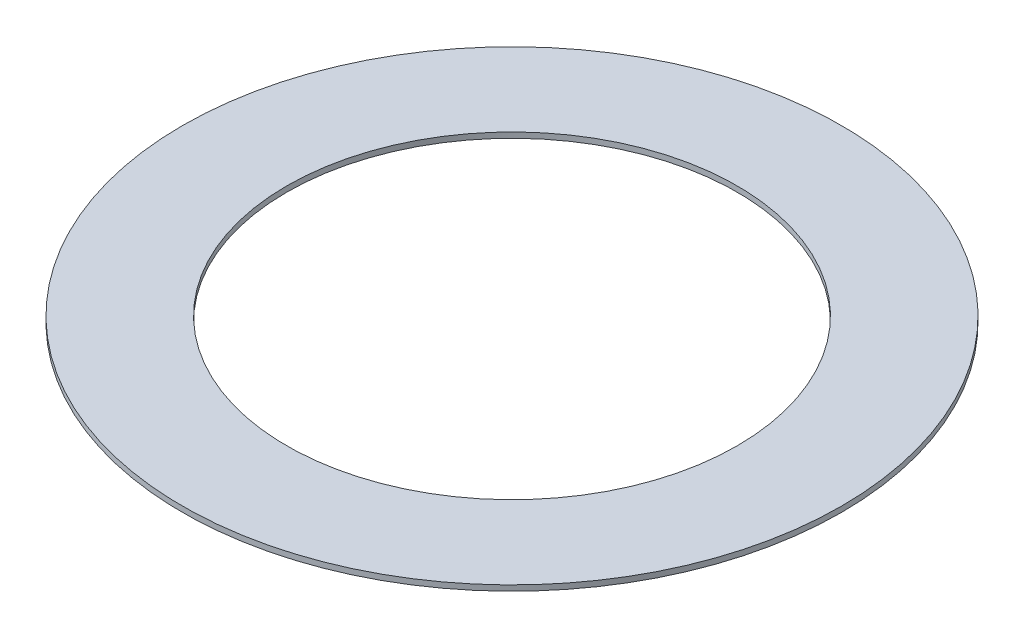
ISO-10303-21;
HEADER;
FILE_DESCRIPTION(('STEP AP214'),'2;1');
FILE_NAME('part.step','',(''),(''),'','','');
FILE_SCHEMA(('AUTOMOTIVE_DESIGN { 1 0 10303 214 1 1 1 1 }'));
ENDSEC;
DATA;
#1=APPLICATION_CONTEXT('core data for automotive mechanical design processes');
#2=APPLICATION_PROTOCOL_DEFINITION('international standard','automotive_design',2000,#1);
#3=PRODUCT_CONTEXT('',#1,'mechanical');
#4=PRODUCT('Part','Part','',(#3));
#5=PRODUCT_RELATED_PRODUCT_CATEGORY('part','',(#4));
#6=PRODUCT_DEFINITION_FORMATION('','',#4);
#7=PRODUCT_DEFINITION_CONTEXT('part definition',#1,'design');
#8=PRODUCT_DEFINITION('design','',#6,#7);
#9=PRODUCT_DEFINITION_SHAPE('','',#8);
#10=(LENGTH_UNIT() NAMED_UNIT(*) SI_UNIT(.MILLI.,.METRE.));
#11=(NAMED_UNIT(*) PLANE_ANGLE_UNIT() SI_UNIT($,.RADIAN.));
#12=(NAMED_UNIT(*) SI_UNIT($,.STERADIAN.) SOLID_ANGLE_UNIT());
#13=UNCERTAINTY_MEASURE_WITH_UNIT(LENGTH_MEASURE(1.E-05),#10,'distance_accuracy_value','');
#14=(GEOMETRIC_REPRESENTATION_CONTEXT(3) GLOBAL_UNCERTAINTY_ASSIGNED_CONTEXT((#13)) GLOBAL_UNIT_ASSIGNED_CONTEXT((#10,
#11,#12)) REPRESENTATION_CONTEXT('',''));
#15=CARTESIAN_POINT('',(0.,0.,0.));
#16=DIRECTION('',(0.,0.,1.));
#17=DIRECTION('',(1.,0.,0.));
#18=AXIS2_PLACEMENT_3D('',#15,#16,#17);
#19=CARTESIAN_POINT('',(240.,-179.8,75.));
#20=DIRECTION('',(0.,-1.,0.));
#21=DIRECTION('',(1.,0.,0.));
#22=AXIS2_PLACEMENT_3D('',#19,#20,#21);
#23=CYLINDRICAL_SURFACE('',#22,4.1);
#24=CARTESIAN_POINT('',(240.,-180.,75.));
#25=DIRECTION('',(0.,1.,0.));
#26=DIRECTION('',(1.,0.,0.));
#27=AXIS2_PLACEMENT_3D('',#24,#25,#26);
#28=CIRCLE('',#27,4.1);
#29=CARTESIAN_POINT('',(244.1,-180.,75.));
#30=VERTEX_POINT('',#29);
#31=EDGE_CURVE('E54',#30,#30,#28,.T.);
#32=ORIENTED_EDGE('',*,*,#31,.F.);
#33=DIRECTION('',(0.,-1.,0.));
#34=VECTOR('',#33,1.);
#35=CARTESIAN_POINT('',(244.1,-179.8,75.));
#36=LINE('',#35,#34);
#37=CARTESIAN_POINT('',(244.1,-179.9,75.));
#38=VERTEX_POINT('',#37);
#39=EDGE_CURVE('E11',#38,#30,#36,.T.);
#40=ORIENTED_EDGE('',*,*,#39,.F.);
#41=CARTESIAN_POINT('',(240.,-179.9,75.));
#42=DIRECTION('',(0.,1.,0.));
#43=DIRECTION('',(1.,0.,0.));
#44=AXIS2_PLACEMENT_3D('',#41,#42,#43);
#45=CIRCLE('',#44,4.1);
#46=EDGE_CURVE('E25',#38,#38,#45,.T.);
#47=ORIENTED_EDGE('',*,*,#46,.T.);
#48=ORIENTED_EDGE('',*,*,#39,.T.);
#49=EDGE_LOOP('',(#32,#40,#47,#48));
#50=FACE_BOUND('',#49,.T.);
#51=ADVANCED_FACE('F16',(#50),#23,.F.);
#52=CARTESIAN_POINT('',(240.,-179.9,75.));
#53=DIRECTION('',(0.,-1.,0.));
#54=DIRECTION('',(-1.,0.,0.));
#55=AXIS2_PLACEMENT_3D('',#52,#53,#54);
#56=PLANE('',#55);
#57=ORIENTED_EDGE('',*,*,#46,.F.);
#58=EDGE_LOOP('',(#57));
#59=FACE_BOUND('',#58,.T.);
#60=CARTESIAN_POINT('',(240.,-179.9,75.));
#61=DIRECTION('',(0.,1.,0.));
#62=DIRECTION('',(1.,0.,0.));
#63=AXIS2_PLACEMENT_3D('',#60,#61,#62);
#64=CIRCLE('',#63,6.);
#65=CARTESIAN_POINT('',(246.,-179.9,75.));
#66=VERTEX_POINT('',#65);
#67=EDGE_CURVE('E55',#66,#66,#64,.T.);
#68=ORIENTED_EDGE('',*,*,#67,.T.);
#69=EDGE_LOOP('',(#68));
#70=FACE_BOUND('',#69,.T.);
#71=ADVANCED_FACE('F67',(#59,#70),#56,.F.);
#72=CARTESIAN_POINT('',(240.,-180.,75.));
#73=DIRECTION('',(0.,-1.,0.));
#74=DIRECTION('',(-1.,0.,0.));
#75=AXIS2_PLACEMENT_3D('',#72,#73,#74);
#76=PLANE('',#75);
#77=ORIENTED_EDGE('',*,*,#31,.T.);
#78=EDGE_LOOP('',(#77));
#79=FACE_BOUND('',#78,.T.);
#80=CARTESIAN_POINT('',(240.,-180.,75.));
#81=DIRECTION('',(0.,1.,0.));
#82=DIRECTION('',(1.,0.,0.));
#83=AXIS2_PLACEMENT_3D('',#80,#81,#82);
#84=CIRCLE('',#83,6.);
#85=CARTESIAN_POINT('',(246.,-180.,75.));
#86=VERTEX_POINT('',#85);
#87=EDGE_CURVE('E48',#86,#86,#84,.T.);
#88=ORIENTED_EDGE('',*,*,#87,.F.);
#89=EDGE_LOOP('',(#88));
#90=FACE_BOUND('',#89,.T.);
#91=ADVANCED_FACE('F70',(#79,#90),#76,.T.);
#92=CARTESIAN_POINT('',(240.,-179.9,75.));
#93=DIRECTION('',(0.,-1.,0.));
#94=DIRECTION('',(1.,0.,0.));
#95=AXIS2_PLACEMENT_3D('',#92,#93,#94);
#96=CYLINDRICAL_SURFACE('',#95,6.);
#97=DIRECTION('',(0.,-1.,0.));
#98=VECTOR('',#97,1.);
#99=CARTESIAN_POINT('',(246.,-179.9,75.));
#100=LINE('',#99,#98);
#101=EDGE_CURVE('E51',#66,#86,#100,.T.);
#102=ORIENTED_EDGE('',*,*,#101,.F.);
#103=ORIENTED_EDGE('',*,*,#67,.F.);
#104=ORIENTED_EDGE('',*,*,#101,.T.);
#105=ORIENTED_EDGE('',*,*,#87,.T.);
#106=EDGE_LOOP('',(#102,#103,#104,#105));
#107=FACE_BOUND('',#106,.T.);
#108=ADVANCED_FACE('F49',(#107),#96,.T.);
#109=CLOSED_SHELL('',(#51,#71,#91,#108));
#110=MANIFOLD_SOLID_BREP('B1',#109);
#111=ADVANCED_BREP_SHAPE_REPRESENTATION('',(#18,#110),#14);
#112=SHAPE_DEFINITION_REPRESENTATION(#9,#111);
ENDSEC;
END-ISO-10303-21;
